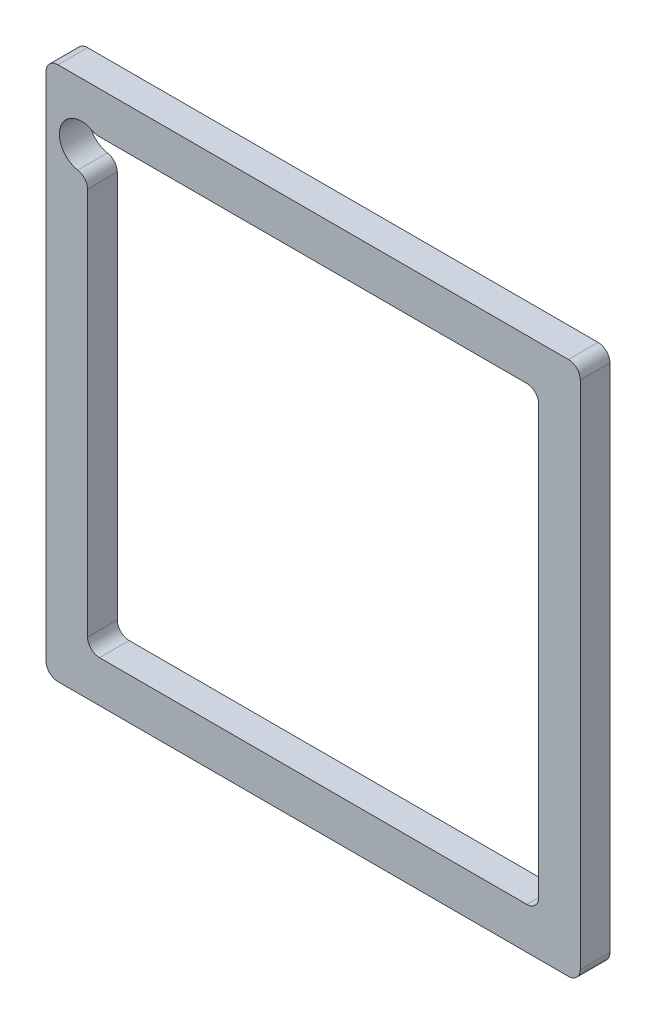
ISO-10303-21;
HEADER;
FILE_DESCRIPTION(('STEP AP214'),'2;1');
FILE_NAME('part.step','',(''),(''),'','','');
FILE_SCHEMA(('AUTOMOTIVE_DESIGN { 1 0 10303 214 1 1 1 1 }'));
ENDSEC;
DATA;
#1=APPLICATION_CONTEXT('core data for automotive mechanical design processes');
#2=APPLICATION_PROTOCOL_DEFINITION('international standard','automotive_design',2000,#1);
#3=PRODUCT_CONTEXT('',#1,'mechanical');
#4=PRODUCT('Part','Part','',(#3));
#5=PRODUCT_RELATED_PRODUCT_CATEGORY('part','',(#4));
#6=PRODUCT_DEFINITION_FORMATION('','',#4);
#7=PRODUCT_DEFINITION_CONTEXT('part definition',#1,'design');
#8=PRODUCT_DEFINITION('design','',#6,#7);
#9=PRODUCT_DEFINITION_SHAPE('','',#8);
#10=(LENGTH_UNIT() NAMED_UNIT(*) SI_UNIT(.MILLI.,.METRE.));
#11=(NAMED_UNIT(*) PLANE_ANGLE_UNIT() SI_UNIT($,.RADIAN.));
#12=(NAMED_UNIT(*) SI_UNIT($,.STERADIAN.) SOLID_ANGLE_UNIT());
#13=UNCERTAINTY_MEASURE_WITH_UNIT(LENGTH_MEASURE(1.E-05),#10,'distance_accuracy_value','');
#14=(GEOMETRIC_REPRESENTATION_CONTEXT(3) GLOBAL_UNCERTAINTY_ASSIGNED_CONTEXT((#13)) GLOBAL_UNIT_ASSIGNED_CONTEXT((#10,
#11,#12)) REPRESENTATION_CONTEXT('',''));
#15=CARTESIAN_POINT('',(0.,0.,0.));
#16=DIRECTION('',(0.,0.,1.));
#17=DIRECTION('',(1.,0.,0.));
#18=AXIS2_PLACEMENT_3D('',#15,#16,#17);
#19=CARTESIAN_POINT('',(-54.61,-54.61,3.175));
#20=DIRECTION('',(0.,0.,-1.));
#21=DIRECTION('',(-1.,0.,0.));
#22=AXIS2_PLACEMENT_3D('',#19,#20,#21);
#23=PLANE('',#22);
#24=CARTESIAN_POINT('',(-54.61,-54.61,3.175));
#25=DIRECTION('',(0.,0.,1.));
#26=DIRECTION('',(-1.,0.,0.));
#27=AXIS2_PLACEMENT_3D('',#24,#25,#26);
#28=CIRCLE('',#27,2.54);
#29=CARTESIAN_POINT('',(-57.1500000000001,-54.61,3.175));
#30=VERTEX_POINT('',#29);
#31=CARTESIAN_POINT('',(-54.61,-57.15,3.175));
#32=VERTEX_POINT('',#31);
#33=EDGE_CURVE('E283',#30,#32,#28,.T.);
#34=ORIENTED_EDGE('',*,*,#33,.T.);
#35=DIRECTION('',(1.,0.,0.));
#36=VECTOR('',#35,1.);
#37=CARTESIAN_POINT('',(-54.61,-57.15,3.175));
#38=LINE('',#37,#36);
#39=CARTESIAN_POINT('',(54.61,-57.15,3.175));
#40=VERTEX_POINT('',#39);
#41=EDGE_CURVE('E287',#32,#40,#38,.T.);
#42=ORIENTED_EDGE('',*,*,#41,.T.);
#43=CARTESIAN_POINT('',(54.6100000000001,-54.61,3.175));
#44=DIRECTION('',(0.,0.,1.));
#45=DIRECTION('',(1.,0.,0.));
#46=AXIS2_PLACEMENT_3D('',#43,#44,#45);
#47=CIRCLE('',#46,2.53999999999999);
#48=CARTESIAN_POINT('',(57.1500000000001,-54.61,3.175));
#49=VERTEX_POINT('',#48);
#50=EDGE_CURVE('E291',#40,#49,#47,.T.);
#51=ORIENTED_EDGE('',*,*,#50,.T.);
#52=DIRECTION('',(0.,1.,0.));
#53=VECTOR('',#52,1.);
#54=CARTESIAN_POINT('',(57.1500000000001,-54.61,3.175));
#55=LINE('',#54,#53);
#56=CARTESIAN_POINT('',(57.15,54.61,3.175));
#57=VERTEX_POINT('',#56);
#58=EDGE_CURVE('E294',#49,#57,#55,.T.);
#59=ORIENTED_EDGE('',*,*,#58,.T.);
#60=CARTESIAN_POINT('',(54.6100000000001,54.61,3.175));
#61=DIRECTION('',(0.,0.,1.));
#62=DIRECTION('',(-1.,0.,0.));
#63=AXIS2_PLACEMENT_3D('',#60,#61,#62);
#64=CIRCLE('',#63,2.53999999999997);
#65=CARTESIAN_POINT('',(54.61,57.15,3.175));
#66=VERTEX_POINT('',#65);
#67=EDGE_CURVE('E297',#57,#66,#64,.T.);
#68=ORIENTED_EDGE('',*,*,#67,.T.);
#69=DIRECTION('',(-1.,0.,0.));
#70=VECTOR('',#69,1.);
#71=CARTESIAN_POINT('',(-54.61,57.15,3.175));
#72=LINE('',#71,#70);
#73=CARTESIAN_POINT('',(-54.61,57.15,3.175));
#74=VERTEX_POINT('',#73);
#75=EDGE_CURVE('E300',#66,#74,#72,.T.);
#76=ORIENTED_EDGE('',*,*,#75,.T.);
#77=CARTESIAN_POINT('',(-54.61,54.61,3.175));
#78=DIRECTION('',(0.,0.,1.));
#79=DIRECTION('',(-1.,0.,0.));
#80=AXIS2_PLACEMENT_3D('',#77,#78,#79);
#81=CIRCLE('',#80,2.54);
#82=CARTESIAN_POINT('',(-57.15,54.61,3.175));
#83=VERTEX_POINT('',#82);
#84=EDGE_CURVE('E303',#74,#83,#81,.T.);
#85=ORIENTED_EDGE('',*,*,#84,.T.);
#86=DIRECTION('',(0.,-1.,0.));
#87=VECTOR('',#86,1.);
#88=CARTESIAN_POINT('',(-57.1500000000001,-54.61,3.175));
#89=LINE('',#88,#87);
#90=EDGE_CURVE('E306',#83,#30,#89,.T.);
#91=ORIENTED_EDGE('',*,*,#90,.T.);
#92=EDGE_LOOP('',(#34,#42,#51,#59,#68,#76,#85,#91));
#93=FACE_BOUND('',#92,.T.);
#94=CARTESIAN_POINT('',(-45.9238932004171,50.8000000000001,3.175));
#95=DIRECTION('',(0.,0.,-1.));
#96=DIRECTION('',(-1.,0.,0.));
#97=AXIS2_PLACEMENT_3D('',#94,#95,#96);
#98=CIRCLE('',#97,2.54);
#99=CARTESIAN_POINT('',(-45.9238932004171,48.2600000000001,3.175));
#100=VERTEX_POINT('',#99);
#101=CARTESIAN_POINT('',(-47.1781912176633,48.5913043478262,3.175));
#102=VERTEX_POINT('',#101);
#103=EDGE_CURVE('E171',#100,#102,#98,.T.);
#104=ORIENTED_EDGE('',*,*,#103,.F.);
#105=DIRECTION('',(-1.,0.,0.));
#106=VECTOR('',#105,1.);
#107=CARTESIAN_POINT('',(12.3175251326519,48.26,3.175));
#108=LINE('',#107,#106);
#109=CARTESIAN_POINT('',(45.72,48.2599999999999,3.175));
#110=VERTEX_POINT('',#109);
#111=EDGE_CURVE('E218',#110,#100,#108,.T.);
#112=ORIENTED_EDGE('',*,*,#111,.F.);
#113=CARTESIAN_POINT('',(45.72,45.72,3.175));
#114=DIRECTION('',(0.,0.,1.));
#115=DIRECTION('',(-1.,0.,0.));
#116=AXIS2_PLACEMENT_3D('',#113,#114,#115);
#117=CIRCLE('',#116,2.5400000000002);
#118=CARTESIAN_POINT('',(48.2600000000002,45.72,3.175));
#119=VERTEX_POINT('',#118);
#120=EDGE_CURVE('E215',#119,#110,#117,.T.);
#121=ORIENTED_EDGE('',*,*,#120,.F.);
#122=DIRECTION('',(0.,1.,0.));
#123=VECTOR('',#122,1.);
#124=CARTESIAN_POINT('',(48.26,-17.5136003743364,3.175));
#125=LINE('',#124,#123);
#126=CARTESIAN_POINT('',(48.26,-45.72,3.175));
#127=VERTEX_POINT('',#126);
#128=EDGE_CURVE('E212',#127,#119,#125,.T.);
#129=ORIENTED_EDGE('',*,*,#128,.F.);
#130=CARTESIAN_POINT('',(45.72,-45.72,3.175));
#131=DIRECTION('',(0.,0.,1.));
#132=DIRECTION('',(1.,0.,0.));
#133=AXIS2_PLACEMENT_3D('',#130,#131,#132);
#134=CIRCLE('',#133,2.54);
#135=CARTESIAN_POINT('',(45.7199999999999,-48.26,3.175));
#136=VERTEX_POINT('',#135);
#137=EDGE_CURVE('E209',#136,#127,#134,.T.);
#138=ORIENTED_EDGE('',*,*,#137,.F.);
#139=DIRECTION('',(1.,0.,0.));
#140=VECTOR('',#139,1.);
#141=CARTESIAN_POINT('',(-45.72,-48.26,3.175));
#142=LINE('',#141,#140);
#143=CARTESIAN_POINT('',(-45.72,-48.26,3.175));
#144=VERTEX_POINT('',#143);
#145=EDGE_CURVE('E206',#144,#136,#142,.T.);
#146=ORIENTED_EDGE('',*,*,#145,.F.);
#147=CARTESIAN_POINT('',(-45.72,-45.72,3.175));
#148=DIRECTION('',(0.,0.,1.));
#149=DIRECTION('',(-1.,0.,0.));
#150=AXIS2_PLACEMENT_3D('',#147,#148,#149);
#151=CIRCLE('',#150,2.54);
#152=CARTESIAN_POINT('',(-48.26,-45.72,3.175));
#153=VERTEX_POINT('',#152);
#154=EDGE_CURVE('E203',#153,#144,#151,.T.);
#155=ORIENTED_EDGE('',*,*,#154,.F.);
#156=DIRECTION('',(0.,-1.,0.));
#157=VECTOR('',#156,1.);
#158=CARTESIAN_POINT('',(-48.26,-0.752095073024893,3.175));
#159=LINE('',#158,#157);
#160=CARTESIAN_POINT('',(-48.26,37.2587827004046,3.175));
#161=VERTEX_POINT('',#160);
#162=EDGE_CURVE('E198',#161,#153,#159,.T.);
#163=ORIENTED_EDGE('',*,*,#162,.F.);
#164=CARTESIAN_POINT('',(-50.8,37.2587827004046,3.175));
#165=DIRECTION('',(0.,0.,-1.));
#166=DIRECTION('',(1.,0.,0.));
#167=AXIS2_PLACEMENT_3D('',#164,#165,#166);
#168=CIRCLE('',#167,2.54);
#169=CARTESIAN_POINT('',(-50.3582608695652,39.7600756741769,3.175));
#170=VERTEX_POINT('',#169);
#171=EDGE_CURVE('E194',#170,#161,#168,.T.);
#172=ORIENTED_EDGE('',*,*,#171,.F.);
#173=CARTESIAN_POINT('',(-49.5300000000001,44.45,3.175));
#174=DIRECTION('',(0.,0.,1.));
#175=DIRECTION('',(1.,0.,0.));
#176=AXIS2_PLACEMENT_3D('',#173,#174,#175);
#177=CIRCLE('',#176,4.7625);
#178=EDGE_CURVE('E180',#102,#170,#177,.T.);
#179=ORIENTED_EDGE('',*,*,#178,.F.);
#180=EDGE_LOOP('',(#104,#112,#121,#129,#138,#146,#155,#163,#172,#179));
#181=FACE_BOUND('',#180,.T.);
#182=ADVANCED_FACE('F45',(#93,#181),#23,.F.);
#183=CARTESIAN_POINT('',(-54.61,-54.61,-3.175));
#184=DIRECTION('',(0.,0.,-1.));
#185=DIRECTION('',(-1.,0.,0.));
#186=AXIS2_PLACEMENT_3D('',#183,#184,#185);
#187=PLANE('',#186);
#188=CARTESIAN_POINT('',(-54.61,-54.61,-3.175));
#189=DIRECTION('',(0.,0.,1.));
#190=DIRECTION('',(-1.,0.,0.));
#191=AXIS2_PLACEMENT_3D('',#188,#189,#190);
#192=CIRCLE('',#191,2.54);
#193=CARTESIAN_POINT('',(-57.1500000000001,-54.61,-3.175));
#194=VERTEX_POINT('',#193);
#195=CARTESIAN_POINT('',(-54.61,-57.15,-3.175));
#196=VERTEX_POINT('',#195);
#197=EDGE_CURVE('E189',#194,#196,#192,.T.);
#198=ORIENTED_EDGE('',*,*,#197,.F.);
#199=DIRECTION('',(0.,-1.,0.));
#200=VECTOR('',#199,1.);
#201=CARTESIAN_POINT('',(-57.1500000000001,-54.61,-3.175));
#202=LINE('',#201,#200);
#203=CARTESIAN_POINT('',(-57.15,54.61,-3.175));
#204=VERTEX_POINT('',#203);
#205=EDGE_CURVE('E288',#204,#194,#202,.T.);
#206=ORIENTED_EDGE('',*,*,#205,.F.);
#207=CARTESIAN_POINT('',(-54.61,54.61,-3.175));
#208=DIRECTION('',(0.,0.,1.));
#209=DIRECTION('',(-1.,0.,0.));
#210=AXIS2_PLACEMENT_3D('',#207,#208,#209);
#211=CIRCLE('',#210,2.54);
#212=CARTESIAN_POINT('',(-54.61,57.15,-3.175));
#213=VERTEX_POINT('',#212);
#214=EDGE_CURVE('E328',#213,#204,#211,.T.);
#215=ORIENTED_EDGE('',*,*,#214,.F.);
#216=DIRECTION('',(-1.,0.,0.));
#217=VECTOR('',#216,1.);
#218=CARTESIAN_POINT('',(-54.61,57.15,-3.175));
#219=LINE('',#218,#217);
#220=CARTESIAN_POINT('',(54.61,57.15,-3.175));
#221=VERTEX_POINT('',#220);
#222=EDGE_CURVE('E325',#221,#213,#219,.T.);
#223=ORIENTED_EDGE('',*,*,#222,.F.);
#224=CARTESIAN_POINT('',(54.6100000000001,54.61,-3.175));
#225=DIRECTION('',(0.,0.,1.));
#226=DIRECTION('',(-1.,0.,0.));
#227=AXIS2_PLACEMENT_3D('',#224,#225,#226);
#228=CIRCLE('',#227,2.53999999999997);
#229=CARTESIAN_POINT('',(57.15,54.61,-3.175));
#230=VERTEX_POINT('',#229);
#231=EDGE_CURVE('E322',#230,#221,#228,.T.);
#232=ORIENTED_EDGE('',*,*,#231,.F.);
#233=DIRECTION('',(0.,1.,0.));
#234=VECTOR('',#233,1.);
#235=CARTESIAN_POINT('',(57.1500000000001,-54.61,-3.175));
#236=LINE('',#235,#234);
#237=CARTESIAN_POINT('',(57.1500000000001,-54.61,-3.175));
#238=VERTEX_POINT('',#237);
#239=EDGE_CURVE('E319',#238,#230,#236,.T.);
#240=ORIENTED_EDGE('',*,*,#239,.F.);
#241=CARTESIAN_POINT('',(54.6100000000001,-54.61,-3.175));
#242=DIRECTION('',(0.,0.,1.));
#243=DIRECTION('',(1.,0.,0.));
#244=AXIS2_PLACEMENT_3D('',#241,#242,#243);
#245=CIRCLE('',#244,2.53999999999999);
#246=CARTESIAN_POINT('',(54.61,-57.15,-3.175));
#247=VERTEX_POINT('',#246);
#248=EDGE_CURVE('E316',#247,#238,#245,.T.);
#249=ORIENTED_EDGE('',*,*,#248,.F.);
#250=DIRECTION('',(1.,0.,0.));
#251=VECTOR('',#250,1.);
#252=CARTESIAN_POINT('',(-54.61,-57.15,-3.175));
#253=LINE('',#252,#251);
#254=EDGE_CURVE('E313',#196,#247,#253,.T.);
#255=ORIENTED_EDGE('',*,*,#254,.F.);
#256=EDGE_LOOP('',(#198,#206,#215,#223,#232,#240,#249,#255));
#257=FACE_BOUND('',#256,.T.);
#258=DIRECTION('',(-1.,0.,0.));
#259=VECTOR('',#258,1.);
#260=CARTESIAN_POINT('',(-45.9238932004171,48.2600000000001,-3.175));
#261=LINE('',#260,#259);
#262=CARTESIAN_POINT('',(45.72,48.2600000000002,-3.175));
#263=VERTEX_POINT('',#262);
#264=CARTESIAN_POINT('',(-45.9238932004171,48.2600000000001,-3.175));
#265=VERTEX_POINT('',#264);
#266=EDGE_CURVE('E181',#263,#265,#261,.T.);
#267=ORIENTED_EDGE('',*,*,#266,.T.);
#268=CARTESIAN_POINT('',(-45.9238932004171,50.8000000000001,-3.175));
#269=DIRECTION('',(0.,0.,-1.));
#270=DIRECTION('',(-1.,0.,0.));
#271=AXIS2_PLACEMENT_3D('',#268,#269,#270);
#272=CIRCLE('',#271,2.54);
#273=CARTESIAN_POINT('',(-47.1781912176633,48.5913043478262,-3.175));
#274=VERTEX_POINT('',#273);
#275=EDGE_CURVE('E69',#265,#274,#272,.T.);
#276=ORIENTED_EDGE('',*,*,#275,.T.);
#277=CARTESIAN_POINT('',(-49.5300000000001,44.45,-3.175));
#278=DIRECTION('',(0.,0.,1.));
#279=DIRECTION('',(1.,0.,0.));
#280=AXIS2_PLACEMENT_3D('',#277,#278,#279);
#281=CIRCLE('',#280,4.7625);
#282=CARTESIAN_POINT('',(-50.3582608695652,39.7600756741769,-3.175));
#283=VERTEX_POINT('',#282);
#284=EDGE_CURVE('E187',#274,#283,#281,.T.);
#285=ORIENTED_EDGE('',*,*,#284,.T.);
#286=CARTESIAN_POINT('',(-50.8,37.2587827004046,-3.175));
#287=DIRECTION('',(0.,0.,-1.));
#288=DIRECTION('',(1.,0.,0.));
#289=AXIS2_PLACEMENT_3D('',#286,#287,#288);
#290=CIRCLE('',#289,2.54);
#291=CARTESIAN_POINT('',(-48.26,37.2587827004046,-3.175));
#292=VERTEX_POINT('',#291);
#293=EDGE_CURVE('E225',#283,#292,#290,.T.);
#294=ORIENTED_EDGE('',*,*,#293,.T.);
#295=DIRECTION('',(0.,-1.,0.));
#296=VECTOR('',#295,1.);
#297=CARTESIAN_POINT('',(-48.26,-45.72,-3.175));
#298=LINE('',#297,#296);
#299=CARTESIAN_POINT('',(-48.26,-45.72,-3.175));
#300=VERTEX_POINT('',#299);
#301=EDGE_CURVE('E229',#292,#300,#298,.T.);
#302=ORIENTED_EDGE('',*,*,#301,.T.);
#303=CARTESIAN_POINT('',(-45.72,-45.72,-3.175));
#304=DIRECTION('',(0.,0.,1.));
#305=DIRECTION('',(-1.,0.,0.));
#306=AXIS2_PLACEMENT_3D('',#303,#304,#305);
#307=CIRCLE('',#306,2.54);
#308=CARTESIAN_POINT('',(-45.72,-48.26,-3.175));
#309=VERTEX_POINT('',#308);
#310=EDGE_CURVE('E233',#300,#309,#307,.T.);
#311=ORIENTED_EDGE('',*,*,#310,.T.);
#312=DIRECTION('',(1.,0.,0.));
#313=VECTOR('',#312,1.);
#314=CARTESIAN_POINT('',(11.6497319468721,-48.26,-3.175));
#315=LINE('',#314,#313);
#316=CARTESIAN_POINT('',(45.7199999999999,-48.26,-3.175));
#317=VERTEX_POINT('',#316);
#318=EDGE_CURVE('E237',#309,#317,#315,.T.);
#319=ORIENTED_EDGE('',*,*,#318,.T.);
#320=CARTESIAN_POINT('',(45.72,-45.72,-3.175));
#321=DIRECTION('',(0.,0.,1.));
#322=DIRECTION('',(1.,0.,0.));
#323=AXIS2_PLACEMENT_3D('',#320,#321,#322);
#324=CIRCLE('',#323,2.54);
#325=CARTESIAN_POINT('',(48.26,-45.72,-3.175));
#326=VERTEX_POINT('',#325);
#327=EDGE_CURVE('E241',#317,#326,#324,.T.);
#328=ORIENTED_EDGE('',*,*,#327,.T.);
#329=DIRECTION('',(0.,1.,0.));
#330=VECTOR('',#329,1.);
#331=CARTESIAN_POINT('',(48.26,-17.5136003743364,-3.175));
#332=LINE('',#331,#330);
#333=CARTESIAN_POINT('',(48.2600000000002,45.72,-3.175));
#334=VERTEX_POINT('',#333);
#335=EDGE_CURVE('E245',#326,#334,#332,.T.);
#336=ORIENTED_EDGE('',*,*,#335,.T.);
#337=CARTESIAN_POINT('',(45.72,45.72,-3.175));
#338=DIRECTION('',(0.,0.,1.));
#339=DIRECTION('',(-1.,0.,0.));
#340=AXIS2_PLACEMENT_3D('',#337,#338,#339);
#341=CIRCLE('',#340,2.5400000000002);
#342=EDGE_CURVE('E249',#334,#263,#341,.T.);
#343=ORIENTED_EDGE('',*,*,#342,.T.);
#344=EDGE_LOOP('',(#267,#276,#285,#294,#302,#311,#319,#328,#336,#343));
#345=FACE_BOUND('',#344,.T.);
#346=ADVANCED_FACE('F367',(#257,#345),#187,.T.);
#347=CARTESIAN_POINT('',(-54.61,-54.61,3.175));
#348=DIRECTION('',(0.,0.,-1.));
#349=DIRECTION('',(-1.,0.,0.));
#350=AXIS2_PLACEMENT_3D('',#347,#348,#349);
#351=CYLINDRICAL_SURFACE('',#350,2.54);
#352=ORIENTED_EDGE('',*,*,#197,.T.);
#353=DIRECTION('',(0.,0.,-1.));
#354=VECTOR('',#353,1.);
#355=CARTESIAN_POINT('',(-54.61,-57.15,3.175));
#356=LINE('',#355,#354);
#357=EDGE_CURVE('E11',#32,#196,#356,.T.);
#358=ORIENTED_EDGE('',*,*,#357,.F.);
#359=ORIENTED_EDGE('',*,*,#33,.F.);
#360=DIRECTION('',(0.,0.,-1.));
#361=VECTOR('',#360,1.);
#362=CARTESIAN_POINT('',(-57.1500000000001,-54.61,3.175));
#363=LINE('',#362,#361);
#364=EDGE_CURVE('E309',#30,#194,#363,.T.);
#365=ORIENTED_EDGE('',*,*,#364,.T.);
#366=EDGE_LOOP('',(#352,#358,#359,#365));
#367=FACE_BOUND('',#366,.T.);
#368=ADVANCED_FACE('F47',(#367),#351,.T.);
#369=CARTESIAN_POINT('',(-54.61,-57.15,3.175));
#370=DIRECTION('',(0.,1.,0.));
#371=DIRECTION('',(-1.,0.,0.));
#372=AXIS2_PLACEMENT_3D('',#369,#370,#371);
#373=PLANE('',#372);
#374=ORIENTED_EDGE('',*,*,#254,.T.);
#375=DIRECTION('',(0.,0.,-1.));
#376=VECTOR('',#375,1.);
#377=CARTESIAN_POINT('',(54.61,-57.15,3.175));
#378=LINE('',#377,#376);
#379=EDGE_CURVE('E54',#40,#247,#378,.T.);
#380=ORIENTED_EDGE('',*,*,#379,.F.);
#381=ORIENTED_EDGE('',*,*,#41,.F.);
#382=ORIENTED_EDGE('',*,*,#357,.T.);
#383=EDGE_LOOP('',(#374,#380,#381,#382));
#384=FACE_BOUND('',#383,.T.);
#385=ADVANCED_FACE('F384',(#384),#373,.F.);
#386=CARTESIAN_POINT('',(54.6100000000001,-54.61,3.175));
#387=DIRECTION('',(0.,0.,-1.));
#388=DIRECTION('',(-1.,0.,0.));
#389=AXIS2_PLACEMENT_3D('',#386,#387,#388);
#390=CYLINDRICAL_SURFACE('',#389,2.53999999999999);
#391=ORIENTED_EDGE('',*,*,#248,.T.);
#392=DIRECTION('',(0.,0.,-1.));
#393=VECTOR('',#392,1.);
#394=CARTESIAN_POINT('',(57.1500000000001,-54.61,3.175));
#395=LINE('',#394,#393);
#396=EDGE_CURVE('E352',#49,#238,#395,.T.);
#397=ORIENTED_EDGE('',*,*,#396,.F.);
#398=ORIENTED_EDGE('',*,*,#50,.F.);
#399=ORIENTED_EDGE('',*,*,#379,.T.);
#400=EDGE_LOOP('',(#391,#397,#398,#399));
#401=FACE_BOUND('',#400,.T.);
#402=ADVANCED_FACE('F361',(#401),#390,.T.);
#403=CARTESIAN_POINT('',(57.1500000000001,-54.61,3.175));
#404=DIRECTION('',(-1.,0.,0.));
#405=DIRECTION('',(0.,-1.,0.));
#406=AXIS2_PLACEMENT_3D('',#403,#404,#405);
#407=PLANE('',#406);
#408=ORIENTED_EDGE('',*,*,#239,.T.);
#409=DIRECTION('',(0.,0.,-1.));
#410=VECTOR('',#409,1.);
#411=CARTESIAN_POINT('',(57.15,54.61,3.175));
#412=LINE('',#411,#410);
#413=EDGE_CURVE('E348',#57,#230,#412,.T.);
#414=ORIENTED_EDGE('',*,*,#413,.F.);
#415=ORIENTED_EDGE('',*,*,#58,.F.);
#416=ORIENTED_EDGE('',*,*,#396,.T.);
#417=EDGE_LOOP('',(#408,#414,#415,#416));
#418=FACE_BOUND('',#417,.T.);
#419=ADVANCED_FACE('F373',(#418),#407,.F.);
#420=CARTESIAN_POINT('',(54.6100000000001,54.61,3.175));
#421=DIRECTION('',(0.,0.,-1.));
#422=DIRECTION('',(-1.,0.,0.));
#423=AXIS2_PLACEMENT_3D('',#420,#421,#422);
#424=CYLINDRICAL_SURFACE('',#423,2.53999999999997);
#425=ORIENTED_EDGE('',*,*,#231,.T.);
#426=DIRECTION('',(0.,0.,-1.));
#427=VECTOR('',#426,1.);
#428=CARTESIAN_POINT('',(54.61,57.15,3.175));
#429=LINE('',#428,#427);
#430=EDGE_CURVE('E344',#66,#221,#429,.T.);
#431=ORIENTED_EDGE('',*,*,#430,.F.);
#432=ORIENTED_EDGE('',*,*,#67,.F.);
#433=ORIENTED_EDGE('',*,*,#413,.T.);
#434=EDGE_LOOP('',(#425,#431,#432,#433));
#435=FACE_BOUND('',#434,.T.);
#436=ADVANCED_FACE('F377',(#435),#424,.T.);
#437=CARTESIAN_POINT('',(-54.61,57.15,3.175));
#438=DIRECTION('',(0.,-1.,0.));
#439=DIRECTION('',(1.,0.,0.));
#440=AXIS2_PLACEMENT_3D('',#437,#438,#439);
#441=PLANE('',#440);
#442=ORIENTED_EDGE('',*,*,#222,.T.);
#443=DIRECTION('',(0.,0.,-1.));
#444=VECTOR('',#443,1.);
#445=CARTESIAN_POINT('',(-54.61,57.15,3.175));
#446=LINE('',#445,#444);
#447=EDGE_CURVE('E340',#74,#213,#446,.T.);
#448=ORIENTED_EDGE('',*,*,#447,.F.);
#449=ORIENTED_EDGE('',*,*,#75,.F.);
#450=ORIENTED_EDGE('',*,*,#430,.T.);
#451=EDGE_LOOP('',(#442,#448,#449,#450));
#452=FACE_BOUND('',#451,.T.);
#453=ADVANCED_FACE('F397',(#452),#441,.F.);
#454=CARTESIAN_POINT('',(-54.61,54.61,3.175));
#455=DIRECTION('',(0.,0.,-1.));
#456=DIRECTION('',(-1.,0.,0.));
#457=AXIS2_PLACEMENT_3D('',#454,#455,#456);
#458=CYLINDRICAL_SURFACE('',#457,2.54);
#459=ORIENTED_EDGE('',*,*,#214,.T.);
#460=DIRECTION('',(0.,0.,-1.));
#461=VECTOR('',#460,1.);
#462=CARTESIAN_POINT('',(-57.15,54.61,3.175));
#463=LINE('',#462,#461);
#464=EDGE_CURVE('E336',#83,#204,#463,.T.);
#465=ORIENTED_EDGE('',*,*,#464,.F.);
#466=ORIENTED_EDGE('',*,*,#84,.F.);
#467=ORIENTED_EDGE('',*,*,#447,.T.);
#468=EDGE_LOOP('',(#459,#465,#466,#467));
#469=FACE_BOUND('',#468,.T.);
#470=ADVANCED_FACE('F395',(#469),#458,.T.);
#471=CARTESIAN_POINT('',(-57.1500000000001,-54.61,3.175));
#472=DIRECTION('',(1.,0.,0.));
#473=DIRECTION('',(0.,1.,0.));
#474=AXIS2_PLACEMENT_3D('',#471,#472,#473);
#475=PLANE('',#474);
#476=ORIENTED_EDGE('',*,*,#205,.T.);
#477=ORIENTED_EDGE('',*,*,#364,.F.);
#478=ORIENTED_EDGE('',*,*,#90,.F.);
#479=ORIENTED_EDGE('',*,*,#464,.T.);
#480=EDGE_LOOP('',(#476,#477,#478,#479));
#481=FACE_BOUND('',#480,.T.);
#482=ADVANCED_FACE('F390',(#481),#475,.F.);
#483=CARTESIAN_POINT('',(-45.9238932004171,50.8000000000001,3.175));
#484=DIRECTION('',(0.,0.,-1.));
#485=DIRECTION('',(-1.,0.,0.));
#486=AXIS2_PLACEMENT_3D('',#483,#484,#485);
#487=CYLINDRICAL_SURFACE('',#486,2.54);
#488=ORIENTED_EDGE('',*,*,#275,.F.);
#489=DIRECTION('',(0.,0.,-1.));
#490=VECTOR('',#489,1.);
#491=CARTESIAN_POINT('',(-45.9238932004171,48.2600000000001,3.175));
#492=LINE('',#491,#490);
#493=EDGE_CURVE('E175',#100,#265,#492,.T.);
#494=ORIENTED_EDGE('',*,*,#493,.F.);
#495=ORIENTED_EDGE('',*,*,#103,.T.);
#496=DIRECTION('',(0.,0.,-1.));
#497=VECTOR('',#496,1.);
#498=CARTESIAN_POINT('',(-47.1781912176633,48.5913043478262,3.175));
#499=LINE('',#498,#497);
#500=EDGE_CURVE('E174',#102,#274,#499,.T.);
#501=ORIENTED_EDGE('',*,*,#500,.T.);
#502=EDGE_LOOP('',(#488,#494,#495,#501));
#503=FACE_BOUND('',#502,.T.);
#504=ADVANCED_FACE('F173',(#503),#487,.T.);
#505=CARTESIAN_POINT('',(-49.5300000000001,44.45,3.175));
#506=DIRECTION('',(0.,0.,-1.));
#507=DIRECTION('',(-1.,0.,0.));
#508=AXIS2_PLACEMENT_3D('',#505,#506,#507);
#509=CYLINDRICAL_SURFACE('',#508,4.7625);
#510=ORIENTED_EDGE('',*,*,#284,.F.);
#511=ORIENTED_EDGE('',*,*,#500,.F.);
#512=ORIENTED_EDGE('',*,*,#178,.T.);
#513=DIRECTION('',(0.,0.,-1.));
#514=VECTOR('',#513,1.);
#515=CARTESIAN_POINT('',(-50.3582608695652,39.7600756741769,3.175));
#516=LINE('',#515,#514);
#517=EDGE_CURVE('E190',#170,#283,#516,.T.);
#518=ORIENTED_EDGE('',*,*,#517,.T.);
#519=EDGE_LOOP('',(#510,#511,#512,#518));
#520=FACE_BOUND('',#519,.T.);
#521=ADVANCED_FACE('F184',(#520),#509,.F.);
#522=CARTESIAN_POINT('',(-50.8,37.2587827004046,3.175));
#523=DIRECTION('',(0.,0.,-1.));
#524=DIRECTION('',(-1.,0.,0.));
#525=AXIS2_PLACEMENT_3D('',#522,#523,#524);
#526=CYLINDRICAL_SURFACE('',#525,2.54);
#527=ORIENTED_EDGE('',*,*,#293,.F.);
#528=ORIENTED_EDGE('',*,*,#517,.F.);
#529=ORIENTED_EDGE('',*,*,#171,.T.);
#530=DIRECTION('',(0.,0.,-1.));
#531=VECTOR('',#530,1.);
#532=CARTESIAN_POINT('',(-48.26,37.2587827004046,3.175));
#533=LINE('',#532,#531);
#534=EDGE_CURVE('E277',#161,#292,#533,.T.);
#535=ORIENTED_EDGE('',*,*,#534,.T.);
#536=EDGE_LOOP('',(#527,#528,#529,#535));
#537=FACE_BOUND('',#536,.T.);
#538=ADVANCED_FACE('F422',(#537),#526,.T.);
#539=CARTESIAN_POINT('',(-48.26,-45.72,3.175));
#540=DIRECTION('',(1.,0.,0.));
#541=DIRECTION('',(0.,0.,-1.));
#542=AXIS2_PLACEMENT_3D('',#539,#540,#541);
#543=PLANE('',#542);
#544=ORIENTED_EDGE('',*,*,#301,.F.);
#545=ORIENTED_EDGE('',*,*,#534,.F.);
#546=ORIENTED_EDGE('',*,*,#162,.T.);
#547=DIRECTION('',(0.,0.,-1.));
#548=VECTOR('',#547,1.);
#549=CARTESIAN_POINT('',(-48.26,-45.72,3.175));
#550=LINE('',#549,#548);
#551=EDGE_CURVE('E274',#153,#300,#550,.T.);
#552=ORIENTED_EDGE('',*,*,#551,.T.);
#553=EDGE_LOOP('',(#544,#545,#546,#552));
#554=FACE_BOUND('',#553,.T.);
#555=ADVANCED_FACE('F426',(#554),#543,.T.);
#556=CARTESIAN_POINT('',(-45.72,-45.72,3.175));
#557=DIRECTION('',(0.,0.,-1.));
#558=DIRECTION('',(-1.,0.,0.));
#559=AXIS2_PLACEMENT_3D('',#556,#557,#558);
#560=CYLINDRICAL_SURFACE('',#559,2.54);
#561=ORIENTED_EDGE('',*,*,#310,.F.);
#562=ORIENTED_EDGE('',*,*,#551,.F.);
#563=ORIENTED_EDGE('',*,*,#154,.T.);
#564=DIRECTION('',(0.,0.,-1.));
#565=VECTOR('',#564,1.);
#566=CARTESIAN_POINT('',(-45.72,-48.26,3.175));
#567=LINE('',#566,#565);
#568=EDGE_CURVE('E270',#144,#309,#567,.T.);
#569=ORIENTED_EDGE('',*,*,#568,.T.);
#570=EDGE_LOOP('',(#561,#562,#563,#569));
#571=FACE_BOUND('',#570,.T.);
#572=ADVANCED_FACE('F432',(#571),#560,.F.);
#573=CARTESIAN_POINT('',(11.6497319468721,-48.26,3.175));
#574=DIRECTION('',(0.,1.,0.));
#575=DIRECTION('',(0.,0.,1.));
#576=AXIS2_PLACEMENT_3D('',#573,#574,#575);
#577=PLANE('',#576);
#578=ORIENTED_EDGE('',*,*,#318,.F.);
#579=ORIENTED_EDGE('',*,*,#568,.F.);
#580=ORIENTED_EDGE('',*,*,#145,.T.);
#581=DIRECTION('',(0.,0.,-1.));
#582=VECTOR('',#581,1.);
#583=CARTESIAN_POINT('',(45.7199999999999,-48.26,3.175));
#584=LINE('',#583,#582);
#585=EDGE_CURVE('E267',#136,#317,#584,.T.);
#586=ORIENTED_EDGE('',*,*,#585,.T.);
#587=EDGE_LOOP('',(#578,#579,#580,#586));
#588=FACE_BOUND('',#587,.T.);
#589=ADVANCED_FACE('F436',(#588),#577,.T.);
#590=CARTESIAN_POINT('',(45.72,-45.72,3.175));
#591=DIRECTION('',(0.,0.,-1.));
#592=DIRECTION('',(-1.,0.,0.));
#593=AXIS2_PLACEMENT_3D('',#590,#591,#592);
#594=CYLINDRICAL_SURFACE('',#593,2.54);
#595=ORIENTED_EDGE('',*,*,#327,.F.);
#596=ORIENTED_EDGE('',*,*,#585,.F.);
#597=ORIENTED_EDGE('',*,*,#137,.T.);
#598=DIRECTION('',(0.,0.,-1.));
#599=VECTOR('',#598,1.);
#600=CARTESIAN_POINT('',(48.26,-45.72,3.175));
#601=LINE('',#600,#599);
#602=EDGE_CURVE('E263',#127,#326,#601,.T.);
#603=ORIENTED_EDGE('',*,*,#602,.T.);
#604=EDGE_LOOP('',(#595,#596,#597,#603));
#605=FACE_BOUND('',#604,.T.);
#606=ADVANCED_FACE('F440',(#605),#594,.F.);
#607=CARTESIAN_POINT('',(48.26,-17.5136003743364,3.175));
#608=DIRECTION('',(-1.,0.,0.));
#609=DIRECTION('',(0.,-1.,0.));
#610=AXIS2_PLACEMENT_3D('',#607,#608,#609);
#611=PLANE('',#610);
#612=ORIENTED_EDGE('',*,*,#335,.F.);
#613=ORIENTED_EDGE('',*,*,#602,.F.);
#614=ORIENTED_EDGE('',*,*,#128,.T.);
#615=DIRECTION('',(0.,0.,-1.));
#616=VECTOR('',#615,1.);
#617=CARTESIAN_POINT('',(48.2600000000002,45.72,3.175));
#618=LINE('',#617,#616);
#619=EDGE_CURVE('E260',#119,#334,#618,.T.);
#620=ORIENTED_EDGE('',*,*,#619,.T.);
#621=EDGE_LOOP('',(#612,#613,#614,#620));
#622=FACE_BOUND('',#621,.T.);
#623=ADVANCED_FACE('F444',(#622),#611,.T.);
#624=CARTESIAN_POINT('',(45.72,45.72,3.175));
#625=DIRECTION('',(0.,0.,-1.));
#626=DIRECTION('',(-1.,0.,0.));
#627=AXIS2_PLACEMENT_3D('',#624,#625,#626);
#628=CYLINDRICAL_SURFACE('',#627,2.5400000000002);
#629=ORIENTED_EDGE('',*,*,#342,.F.);
#630=ORIENTED_EDGE('',*,*,#619,.F.);
#631=ORIENTED_EDGE('',*,*,#120,.T.);
#632=DIRECTION('',(0.,0.,-1.));
#633=VECTOR('',#632,1.);
#634=CARTESIAN_POINT('',(45.72,48.2600000000002,3.175));
#635=LINE('',#634,#633);
#636=EDGE_CURVE('E61',#110,#263,#635,.T.);
#637=ORIENTED_EDGE('',*,*,#636,.T.);
#638=EDGE_LOOP('',(#629,#630,#631,#637));
#639=FACE_BOUND('',#638,.T.);
#640=ADVANCED_FACE('F448',(#639),#628,.F.);
#641=CARTESIAN_POINT('',(-45.9238932004171,48.2600000000001,3.175));
#642=DIRECTION('',(0.,-1.,0.));
#643=DIRECTION('',(1.,0.,0.));
#644=AXIS2_PLACEMENT_3D('',#641,#642,#643);
#645=PLANE('',#644);
#646=ORIENTED_EDGE('',*,*,#266,.F.);
#647=ORIENTED_EDGE('',*,*,#636,.F.);
#648=ORIENTED_EDGE('',*,*,#111,.T.);
#649=ORIENTED_EDGE('',*,*,#493,.T.);
#650=EDGE_LOOP('',(#646,#647,#648,#649));
#651=FACE_BOUND('',#650,.T.);
#652=ADVANCED_FACE('F452',(#651),#645,.T.);
#653=CLOSED_SHELL('',(#182,#346,#368,#385,#402,#419,#436,#453,#470,#482,#504,#521,#538,#555,
#572,#589,#606,#623,#640,#652));
#654=MANIFOLD_SOLID_BREP('B2',#653);
#655=ADVANCED_BREP_SHAPE_REPRESENTATION('',(#18,#654),#14);
#656=SHAPE_DEFINITION_REPRESENTATION(#9,#655);
ENDSEC;
END-ISO-10303-21;
